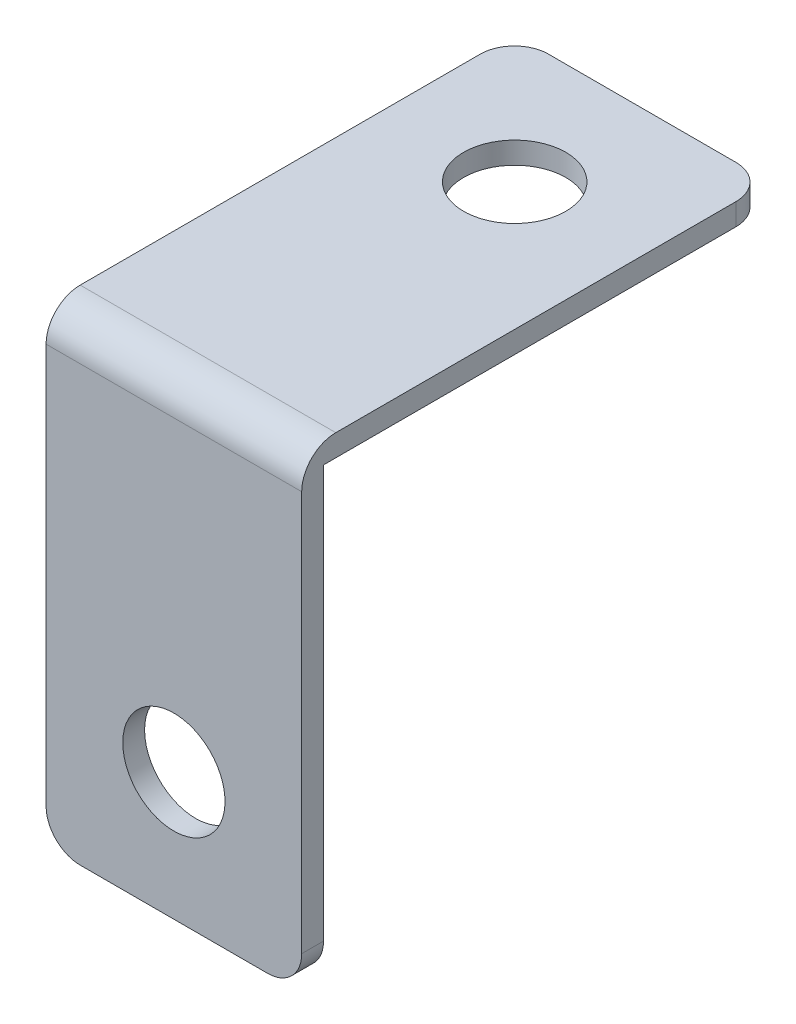
ISO-10303-21;
HEADER;
FILE_DESCRIPTION(('STEP AP214'),'2;1');
FILE_NAME('part.step','',(''),(''),'','','');
FILE_SCHEMA(('AUTOMOTIVE_DESIGN { 1 0 10303 214 1 1 1 1 }'));
ENDSEC;
DATA;
#1=APPLICATION_CONTEXT('core data for automotive mechanical design processes');
#2=APPLICATION_PROTOCOL_DEFINITION('international standard','automotive_design',2000,#1);
#3=PRODUCT_CONTEXT('',#1,'mechanical');
#4=PRODUCT('Part','Part','',(#3));
#5=PRODUCT_RELATED_PRODUCT_CATEGORY('part','',(#4));
#6=PRODUCT_DEFINITION_FORMATION('','',#4);
#7=PRODUCT_DEFINITION_CONTEXT('part definition',#1,'design');
#8=PRODUCT_DEFINITION('design','',#6,#7);
#9=PRODUCT_DEFINITION_SHAPE('','',#8);
#10=(LENGTH_UNIT() NAMED_UNIT(*) SI_UNIT(.MILLI.,.METRE.));
#11=(NAMED_UNIT(*) PLANE_ANGLE_UNIT() SI_UNIT($,.RADIAN.));
#12=(NAMED_UNIT(*) SI_UNIT($,.STERADIAN.) SOLID_ANGLE_UNIT());
#13=UNCERTAINTY_MEASURE_WITH_UNIT(LENGTH_MEASURE(1.E-05),#10,'distance_accuracy_value','');
#14=(GEOMETRIC_REPRESENTATION_CONTEXT(3) GLOBAL_UNCERTAINTY_ASSIGNED_CONTEXT((#13)) GLOBAL_UNIT_ASSIGNED_CONTEXT((#10,
#11,#12)) REPRESENTATION_CONTEXT('',''));
#15=CARTESIAN_POINT('',(0.,0.,0.));
#16=DIRECTION('',(0.,0.,1.));
#17=DIRECTION('',(1.,0.,0.));
#18=AXIS2_PLACEMENT_3D('',#15,#16,#17);
#19=CARTESIAN_POINT('',(0.,0.,17.4498));
#20=DIRECTION('',(1.,0.,0.));
#21=DIRECTION('',(0.,0.,-1.));
#22=AXIS2_PLACEMENT_3D('',#19,#20,#21);
#23=PLANE('',#22);
#24=DIRECTION('',(0.,-1.,0.));
#25=VECTOR('',#24,1.);
#26=CARTESIAN_POINT('',(0.,0.,17.4498));
#27=LINE('',#26,#25);
#28=CARTESIAN_POINT('',(0.,-0.4572,17.4498));
#29=VERTEX_POINT('',#28);
#30=CARTESIAN_POINT('',(0.,-15.367,17.4498));
#31=VERTEX_POINT('',#30);
#32=EDGE_CURVE('E234',#29,#31,#27,.T.);
#33=ORIENTED_EDGE('',*,*,#32,.F.);
#34=CARTESIAN_POINT('',(0.,-0.4572,16.1798));
#35=DIRECTION('',(1.,0.,0.));
#36=DIRECTION('',(0.,0.,-1.));
#37=AXIS2_PLACEMENT_3D('',#34,#35,#36);
#38=CIRCLE('',#37,1.27);
#39=CARTESIAN_POINT('',(0.,0.8128,16.1798));
#40=VERTEX_POINT('',#39);
#41=EDGE_CURVE('E186',#29,#40,#38,.F.);
#42=ORIENTED_EDGE('',*,*,#41,.T.);
#43=DIRECTION('',(0.,0.,-1.));
#44=VECTOR('',#43,1.);
#45=CARTESIAN_POINT('',(0.,0.8128,17.4498));
#46=LINE('',#45,#44);
#47=CARTESIAN_POINT('',(0.,0.8128,1.27));
#48=VERTEX_POINT('',#47);
#49=EDGE_CURVE('E159',#40,#48,#46,.T.);
#50=ORIENTED_EDGE('',*,*,#49,.T.);
#51=DIRECTION('',(0.,-1.,0.));
#52=VECTOR('',#51,1.);
#53=CARTESIAN_POINT('',(0.,0.,1.27));
#54=LINE('',#53,#52);
#55=CARTESIAN_POINT('',(0.,0.,1.27));
#56=VERTEX_POINT('',#55);
#57=EDGE_CURVE('E178',#48,#56,#54,.T.);
#58=ORIENTED_EDGE('',*,*,#57,.T.);
#59=DIRECTION('',(0.,0.,-1.));
#60=VECTOR('',#59,1.);
#61=CARTESIAN_POINT('',(0.,0.,17.4498));
#62=LINE('',#61,#60);
#63=CARTESIAN_POINT('',(0.,0.,16.637));
#64=VERTEX_POINT('',#63);
#65=EDGE_CURVE('E151',#64,#56,#62,.T.);
#66=ORIENTED_EDGE('',*,*,#65,.F.);
#67=DIRECTION('',(0.,1.,0.));
#68=VECTOR('',#67,1.);
#69=CARTESIAN_POINT('',(0.,-16.637,16.637));
#70=LINE('',#69,#68);
#71=CARTESIAN_POINT('',(0.,-15.367,16.637));
#72=VERTEX_POINT('',#71);
#73=EDGE_CURVE('E136',#72,#64,#70,.T.);
#74=ORIENTED_EDGE('',*,*,#73,.F.);
#75=DIRECTION('',(0.,0.,1.));
#76=VECTOR('',#75,1.);
#77=CARTESIAN_POINT('',(0.,-15.367,17.4498));
#78=LINE('',#77,#76);
#79=EDGE_CURVE('E182',#72,#31,#78,.T.);
#80=ORIENTED_EDGE('',*,*,#79,.T.);
#81=EDGE_LOOP('',(#33,#42,#50,#58,#66,#74,#80));
#82=FACE_BOUND('',#81,.T.);
#83=ADVANCED_FACE('F39',(#82),#23,.F.);
#84=CARTESIAN_POINT('',(0.,0.,17.4498));
#85=DIRECTION('',(0.,1.,0.));
#86=DIRECTION('',(0.,0.,1.));
#87=AXIS2_PLACEMENT_3D('',#84,#85,#86);
#88=PLANE('',#87);
#89=CARTESIAN_POINT('',(4.7625,0.,4.7498));
#90=DIRECTION('',(0.,-1.,0.));
#91=DIRECTION('',(0.,0.,-1.));
#92=AXIS2_PLACEMENT_3D('',#89,#90,#91);
#93=CIRCLE('',#92,1.905);
#94=CARTESIAN_POINT('',(4.7625,0.,2.8448));
#95=VERTEX_POINT('',#94);
#96=EDGE_CURVE('E168',#95,#95,#93,.T.);
#97=ORIENTED_EDGE('',*,*,#96,.F.);
#98=EDGE_LOOP('',(#97));
#99=FACE_BOUND('',#98,.T.);
#100=DIRECTION('',(1.,0.,0.));
#101=VECTOR('',#100,1.);
#102=CARTESIAN_POINT('',(0.,0.,0.));
#103=LINE('',#102,#101);
#104=CARTESIAN_POINT('',(1.27,0.,0.));
#105=VERTEX_POINT('',#104);
#106=CARTESIAN_POINT('',(8.255,0.,0.));
#107=VERTEX_POINT('',#106);
#108=EDGE_CURVE('E146',#105,#107,#103,.T.);
#109=ORIENTED_EDGE('',*,*,#108,.T.);
#110=CARTESIAN_POINT('',(8.255,0.,1.27));
#111=DIRECTION('',(0.,1.,0.));
#112=DIRECTION('',(0.,0.,1.));
#113=AXIS2_PLACEMENT_3D('',#110,#111,#112);
#114=CIRCLE('',#113,1.27);
#115=CARTESIAN_POINT('',(9.525,0.,1.27));
#116=VERTEX_POINT('',#115);
#117=EDGE_CURVE('E11',#107,#116,#114,.F.);
#118=ORIENTED_EDGE('',*,*,#117,.T.);
#119=DIRECTION('',(0.,0.,-1.));
#120=VECTOR('',#119,1.);
#121=CARTESIAN_POINT('',(9.525,0.,17.4498));
#122=LINE('',#121,#120);
#123=CARTESIAN_POINT('',(9.525,0.,16.637));
#124=VERTEX_POINT('',#123);
#125=EDGE_CURVE('E129',#124,#116,#122,.T.);
#126=ORIENTED_EDGE('',*,*,#125,.F.);
#127=DIRECTION('',(-1.,0.,0.));
#128=VECTOR('',#127,1.);
#129=CARTESIAN_POINT('',(0.,0.,16.637));
#130=LINE('',#129,#128);
#131=EDGE_CURVE('E140',#124,#64,#130,.T.);
#132=ORIENTED_EDGE('',*,*,#131,.T.);
#133=ORIENTED_EDGE('',*,*,#65,.T.);
#134=CARTESIAN_POINT('',(1.27,0.,1.27));
#135=DIRECTION('',(0.,1.,0.));
#136=DIRECTION('',(0.,0.,1.));
#137=AXIS2_PLACEMENT_3D('',#134,#135,#136);
#138=CIRCLE('',#137,1.27);
#139=EDGE_CURVE('E48',#56,#105,#138,.F.);
#140=ORIENTED_EDGE('',*,*,#139,.T.);
#141=EDGE_LOOP('',(#109,#118,#126,#132,#133,#140));
#142=FACE_BOUND('',#141,.T.);
#143=ADVANCED_FACE('F148',(#99,#142),#88,.F.);
#144=CARTESIAN_POINT('',(9.525,0.,17.4498));
#145=DIRECTION('',(-1.,0.,0.));
#146=DIRECTION('',(0.,0.,1.));
#147=AXIS2_PLACEMENT_3D('',#144,#145,#146);
#148=PLANE('',#147);
#149=DIRECTION('',(0.,0.,-1.));
#150=VECTOR('',#149,1.);
#151=CARTESIAN_POINT('',(9.525,0.8128,17.4498));
#152=LINE('',#151,#150);
#153=CARTESIAN_POINT('',(9.525,0.8128,16.1798));
#154=VERTEX_POINT('',#153);
#155=CARTESIAN_POINT('',(9.525,0.8128,1.27));
#156=VERTEX_POINT('',#155);
#157=EDGE_CURVE('E152',#154,#156,#152,.T.);
#158=ORIENTED_EDGE('',*,*,#157,.F.);
#159=CARTESIAN_POINT('',(9.525,-0.4572,16.1798));
#160=DIRECTION('',(-1.,0.,0.));
#161=DIRECTION('',(0.,0.,1.));
#162=AXIS2_PLACEMENT_3D('',#159,#160,#161);
#163=CIRCLE('',#162,1.27);
#164=CARTESIAN_POINT('',(9.525,-0.4572,17.4498));
#165=VERTEX_POINT('',#164);
#166=EDGE_CURVE('E203',#154,#165,#163,.F.);
#167=ORIENTED_EDGE('',*,*,#166,.T.);
#168=DIRECTION('',(0.,1.,0.));
#169=VECTOR('',#168,1.);
#170=CARTESIAN_POINT('',(9.525,0.,17.4498));
#171=LINE('',#170,#169);
#172=CARTESIAN_POINT('',(9.525,-15.367,17.4498));
#173=VERTEX_POINT('',#172);
#174=EDGE_CURVE('E241',#173,#165,#171,.T.);
#175=ORIENTED_EDGE('',*,*,#174,.F.);
#176=DIRECTION('',(0.,0.,-1.));
#177=VECTOR('',#176,1.);
#178=CARTESIAN_POINT('',(9.525,-15.367,16.637));
#179=LINE('',#178,#177);
#180=CARTESIAN_POINT('',(9.525,-15.367,16.637));
#181=VERTEX_POINT('',#180);
#182=EDGE_CURVE('E133',#173,#181,#179,.T.);
#183=ORIENTED_EDGE('',*,*,#182,.T.);
#184=DIRECTION('',(0.,1.,0.));
#185=VECTOR('',#184,1.);
#186=CARTESIAN_POINT('',(9.525,-16.637,16.637));
#187=LINE('',#186,#185);
#188=EDGE_CURVE('E123',#181,#124,#187,.T.);
#189=ORIENTED_EDGE('',*,*,#188,.T.);
#190=ORIENTED_EDGE('',*,*,#125,.T.);
#191=DIRECTION('',(0.,1.,0.));
#192=VECTOR('',#191,1.);
#193=CARTESIAN_POINT('',(9.525,0.8128,1.27));
#194=LINE('',#193,#192);
#195=EDGE_CURVE('E198',#116,#156,#194,.T.);
#196=ORIENTED_EDGE('',*,*,#195,.T.);
#197=EDGE_LOOP('',(#158,#167,#175,#183,#189,#190,#196));
#198=FACE_BOUND('',#197,.T.);
#199=ADVANCED_FACE('F126',(#198),#148,.F.);
#200=CARTESIAN_POINT('',(0.,0.8128,17.4498));
#201=DIRECTION('',(0.,-1.,0.));
#202=DIRECTION('',(0.,0.,-1.));
#203=AXIS2_PLACEMENT_3D('',#200,#201,#202);
#204=PLANE('',#203);
#205=CARTESIAN_POINT('',(4.7625,0.812799999999999,4.7498));
#206=DIRECTION('',(0.,-1.,0.));
#207=DIRECTION('',(0.,0.,-1.));
#208=AXIS2_PLACEMENT_3D('',#205,#206,#207);
#209=CIRCLE('',#208,1.905);
#210=CARTESIAN_POINT('',(4.7625,0.812799999999999,2.8448));
#211=VERTEX_POINT('',#210);
#212=EDGE_CURVE('E163',#211,#211,#209,.T.);
#213=ORIENTED_EDGE('',*,*,#212,.T.);
#214=EDGE_LOOP('',(#213));
#215=FACE_BOUND('',#214,.T.);
#216=ORIENTED_EDGE('',*,*,#49,.F.);
#217=DIRECTION('',(-1.,0.,0.));
#218=VECTOR('',#217,1.);
#219=CARTESIAN_POINT('',(0.,0.8128,16.1798));
#220=LINE('',#219,#218);
#221=EDGE_CURVE('E195',#40,#154,#220,.F.);
#222=ORIENTED_EDGE('',*,*,#221,.T.);
#223=ORIENTED_EDGE('',*,*,#157,.T.);
#224=CARTESIAN_POINT('',(8.255,0.8128,1.27));
#225=DIRECTION('',(0.,-1.,0.));
#226=DIRECTION('',(0.,0.,-1.));
#227=AXIS2_PLACEMENT_3D('',#224,#225,#226);
#228=CIRCLE('',#227,1.27);
#229=CARTESIAN_POINT('',(8.255,0.8128,0.));
#230=VERTEX_POINT('',#229);
#231=EDGE_CURVE('E192',#156,#230,#228,.F.);
#232=ORIENTED_EDGE('',*,*,#231,.T.);
#233=DIRECTION('',(-1.,0.,0.));
#234=VECTOR('',#233,1.);
#235=CARTESIAN_POINT('',(0.,0.8128,0.));
#236=LINE('',#235,#234);
#237=CARTESIAN_POINT('',(1.27,0.8128,0.));
#238=VERTEX_POINT('',#237);
#239=EDGE_CURVE('E226',#230,#238,#236,.T.);
#240=ORIENTED_EDGE('',*,*,#239,.T.);
#241=CARTESIAN_POINT('',(1.27,0.8128,1.27));
#242=DIRECTION('',(0.,-1.,0.));
#243=DIRECTION('',(0.,0.,-1.));
#244=AXIS2_PLACEMENT_3D('',#241,#242,#243);
#245=CIRCLE('',#244,1.27);
#246=EDGE_CURVE('E189',#238,#48,#245,.F.);
#247=ORIENTED_EDGE('',*,*,#246,.T.);
#248=EDGE_LOOP('',(#216,#222,#223,#232,#240,#247));
#249=FACE_BOUND('',#248,.T.);
#250=ADVANCED_FACE('F231',(#215,#249),#204,.F.);
#251=CARTESIAN_POINT('',(0.,0.,17.4498));
#252=DIRECTION('',(0.,0.,-1.));
#253=DIRECTION('',(-1.,0.,0.));
#254=AXIS2_PLACEMENT_3D('',#251,#252,#253);
#255=PLANE('',#254);
#256=CARTESIAN_POINT('',(4.7625,-11.8872,17.4498));
#257=DIRECTION('',(0.,0.,-1.));
#258=DIRECTION('',(-1.,0.,0.));
#259=AXIS2_PLACEMENT_3D('',#256,#257,#258);
#260=CIRCLE('',#259,1.905);
#261=CARTESIAN_POINT('',(2.8575,-11.8872,17.4498));
#262=VERTEX_POINT('',#261);
#263=EDGE_CURVE('E261',#262,#262,#260,.T.);
#264=ORIENTED_EDGE('',*,*,#263,.T.);
#265=EDGE_LOOP('',(#264));
#266=FACE_BOUND('',#265,.T.);
#267=ORIENTED_EDGE('',*,*,#174,.T.);
#268=DIRECTION('',(-1.,0.,0.));
#269=VECTOR('',#268,1.);
#270=CARTESIAN_POINT('',(0.,-0.4572,17.4498));
#271=LINE('',#270,#269);
#272=EDGE_CURVE('E174',#165,#29,#271,.T.);
#273=ORIENTED_EDGE('',*,*,#272,.T.);
#274=ORIENTED_EDGE('',*,*,#32,.T.);
#275=CARTESIAN_POINT('',(1.27,-15.367,17.4498));
#276=DIRECTION('',(0.,0.,-1.));
#277=DIRECTION('',(-1.,0.,0.));
#278=AXIS2_PLACEMENT_3D('',#275,#276,#277);
#279=CIRCLE('',#278,1.27);
#280=CARTESIAN_POINT('',(1.27,-16.637,17.4498));
#281=VERTEX_POINT('',#280);
#282=EDGE_CURVE('E171',#31,#281,#279,.F.);
#283=ORIENTED_EDGE('',*,*,#282,.T.);
#284=DIRECTION('',(1.,0.,0.));
#285=VECTOR('',#284,1.);
#286=CARTESIAN_POINT('',(0.,-16.637,17.4498));
#287=LINE('',#286,#285);
#288=CARTESIAN_POINT('',(8.255,-16.637,17.4498));
#289=VERTEX_POINT('',#288);
#290=EDGE_CURVE('E167',#281,#289,#287,.T.);
#291=ORIENTED_EDGE('',*,*,#290,.T.);
#292=CARTESIAN_POINT('',(8.255,-15.367,17.4498));
#293=DIRECTION('',(0.,0.,-1.));
#294=DIRECTION('',(-1.,0.,0.));
#295=AXIS2_PLACEMENT_3D('',#292,#293,#294);
#296=CIRCLE('',#295,1.27);
#297=EDGE_CURVE('E156',#289,#173,#296,.F.);
#298=ORIENTED_EDGE('',*,*,#297,.T.);
#299=EDGE_LOOP('',(#267,#273,#274,#283,#291,#298));
#300=FACE_BOUND('',#299,.T.);
#301=ADVANCED_FACE('F283',(#266,#300),#255,.F.);
#302=CARTESIAN_POINT('',(0.,0.,0.));
#303=DIRECTION('',(0.,0.,-1.));
#304=DIRECTION('',(-1.,0.,0.));
#305=AXIS2_PLACEMENT_3D('',#302,#303,#304);
#306=PLANE('',#305);
#307=ORIENTED_EDGE('',*,*,#239,.F.);
#308=DIRECTION('',(0.,1.,0.));
#309=VECTOR('',#308,1.);
#310=CARTESIAN_POINT('',(8.255,0.,0.));
#311=LINE('',#310,#309);
#312=EDGE_CURVE('E55',#230,#107,#311,.F.);
#313=ORIENTED_EDGE('',*,*,#312,.T.);
#314=ORIENTED_EDGE('',*,*,#108,.F.);
#315=DIRECTION('',(0.,-1.,0.));
#316=VECTOR('',#315,1.);
#317=CARTESIAN_POINT('',(1.27,0.8128,0.));
#318=LINE('',#317,#316);
#319=EDGE_CURVE('E218',#105,#238,#318,.F.);
#320=ORIENTED_EDGE('',*,*,#319,.T.);
#321=EDGE_LOOP('',(#307,#313,#314,#320));
#322=FACE_BOUND('',#321,.T.);
#323=ADVANCED_FACE('F225',(#322),#306,.T.);
#324=CARTESIAN_POINT('',(0.,-16.637,16.637));
#325=DIRECTION('',(0.,0.,-1.));
#326=DIRECTION('',(-1.,0.,0.));
#327=AXIS2_PLACEMENT_3D('',#324,#325,#326);
#328=PLANE('',#327);
#329=CARTESIAN_POINT('',(4.7625,-11.8872,16.637));
#330=DIRECTION('',(0.,0.,-1.));
#331=DIRECTION('',(-1.,0.,0.));
#332=AXIS2_PLACEMENT_3D('',#329,#330,#331);
#333=CIRCLE('',#332,1.905);
#334=CARTESIAN_POINT('',(2.8575,-11.8872,16.637));
#335=VERTEX_POINT('',#334);
#336=EDGE_CURVE('E265',#335,#335,#333,.T.);
#337=ORIENTED_EDGE('',*,*,#336,.F.);
#338=EDGE_LOOP('',(#337));
#339=FACE_BOUND('',#338,.T.);
#340=DIRECTION('',(-1.,0.,0.));
#341=VECTOR('',#340,1.);
#342=CARTESIAN_POINT('',(0.,-16.637,16.637));
#343=LINE('',#342,#341);
#344=CARTESIAN_POINT('',(8.255,-16.637,16.637));
#345=VERTEX_POINT('',#344);
#346=CARTESIAN_POINT('',(1.27,-16.637,16.637));
#347=VERTEX_POINT('',#346);
#348=EDGE_CURVE('E137',#345,#347,#343,.T.);
#349=ORIENTED_EDGE('',*,*,#348,.T.);
#350=CARTESIAN_POINT('',(1.27,-15.367,16.637));
#351=DIRECTION('',(0.,0.,-1.));
#352=DIRECTION('',(-1.,0.,0.));
#353=AXIS2_PLACEMENT_3D('',#350,#351,#352);
#354=CIRCLE('',#353,1.27);
#355=EDGE_CURVE('E215',#347,#72,#354,.T.);
#356=ORIENTED_EDGE('',*,*,#355,.T.);
#357=ORIENTED_EDGE('',*,*,#73,.T.);
#358=ORIENTED_EDGE('',*,*,#131,.F.);
#359=ORIENTED_EDGE('',*,*,#188,.F.);
#360=CARTESIAN_POINT('',(8.255,-15.367,16.637));
#361=DIRECTION('',(0.,0.,-1.));
#362=DIRECTION('',(-1.,0.,0.));
#363=AXIS2_PLACEMENT_3D('',#360,#361,#362);
#364=CIRCLE('',#363,1.27);
#365=EDGE_CURVE('E212',#181,#345,#364,.T.);
#366=ORIENTED_EDGE('',*,*,#365,.T.);
#367=EDGE_LOOP('',(#349,#356,#357,#358,#359,#366));
#368=FACE_BOUND('',#367,.T.);
#369=ADVANCED_FACE('F142',(#339,#368),#328,.T.);
#370=CARTESIAN_POINT('',(0.,-16.637,0.));
#371=DIRECTION('',(0.,-1.,0.));
#372=DIRECTION('',(0.,0.,-1.));
#373=AXIS2_PLACEMENT_3D('',#370,#371,#372);
#374=PLANE('',#373);
#375=ORIENTED_EDGE('',*,*,#290,.F.);
#376=DIRECTION('',(0.,0.,1.));
#377=VECTOR('',#376,1.);
#378=CARTESIAN_POINT('',(1.27,-16.637,16.637));
#379=LINE('',#378,#377);
#380=EDGE_CURVE('E209',#281,#347,#379,.F.);
#381=ORIENTED_EDGE('',*,*,#380,.T.);
#382=ORIENTED_EDGE('',*,*,#348,.F.);
#383=DIRECTION('',(0.,0.,-1.));
#384=VECTOR('',#383,1.);
#385=CARTESIAN_POINT('',(8.255,-16.637,17.4498));
#386=LINE('',#385,#384);
#387=EDGE_CURVE('E206',#345,#289,#386,.F.);
#388=ORIENTED_EDGE('',*,*,#387,.T.);
#389=EDGE_LOOP('',(#375,#381,#382,#388));
#390=FACE_BOUND('',#389,.T.);
#391=ADVANCED_FACE('F274',(#390),#374,.T.);
#392=CARTESIAN_POINT('',(4.7625,17.4498,4.7498));
#393=DIRECTION('',(0.,-1.,0.));
#394=DIRECTION('',(0.,0.,-1.));
#395=AXIS2_PLACEMENT_3D('',#392,#393,#394);
#396=CYLINDRICAL_SURFACE('',#395,1.905);
#397=ORIENTED_EDGE('',*,*,#96,.T.);
#398=EDGE_LOOP('',(#397));
#399=FACE_BOUND('',#398,.T.);
#400=ORIENTED_EDGE('',*,*,#212,.F.);
#401=EDGE_LOOP('',(#400));
#402=FACE_BOUND('',#401,.T.);
#403=ADVANCED_FACE('F280',(#399,#402),#396,.F.);
#404=CARTESIAN_POINT('',(4.7625,-11.8872,34.0868));
#405=DIRECTION('',(0.,0.,-1.));
#406=DIRECTION('',(-1.,0.,0.));
#407=AXIS2_PLACEMENT_3D('',#404,#405,#406);
#408=CYLINDRICAL_SURFACE('',#407,1.905);
#409=ORIENTED_EDGE('',*,*,#336,.T.);
#410=EDGE_LOOP('',(#409));
#411=FACE_BOUND('',#410,.T.);
#412=ORIENTED_EDGE('',*,*,#263,.F.);
#413=EDGE_LOOP('',(#412));
#414=FACE_BOUND('',#413,.T.);
#415=ADVANCED_FACE('F270',(#411,#414),#408,.F.);
#416=CARTESIAN_POINT('',(0.,-0.4572,16.1798));
#417=DIRECTION('',(-1.,0.,0.));
#418=DIRECTION('',(0.,0.,1.));
#419=AXIS2_PLACEMENT_3D('',#416,#417,#418);
#420=CYLINDRICAL_SURFACE('',#419,1.27);
#421=ORIENTED_EDGE('',*,*,#166,.F.);
#422=ORIENTED_EDGE('',*,*,#221,.F.);
#423=ORIENTED_EDGE('',*,*,#41,.F.);
#424=ORIENTED_EDGE('',*,*,#272,.F.);
#425=EDGE_LOOP('',(#421,#422,#423,#424));
#426=FACE_BOUND('',#425,.T.);
#427=ADVANCED_FACE('F295',(#426),#420,.T.);
#428=CARTESIAN_POINT('',(1.27,-15.367,17.4498));
#429=DIRECTION('',(0.,0.,-1.));
#430=DIRECTION('',(-1.,0.,0.));
#431=AXIS2_PLACEMENT_3D('',#428,#429,#430);
#432=CYLINDRICAL_SURFACE('',#431,1.27);
#433=ORIENTED_EDGE('',*,*,#355,.F.);
#434=ORIENTED_EDGE('',*,*,#380,.F.);
#435=ORIENTED_EDGE('',*,*,#282,.F.);
#436=ORIENTED_EDGE('',*,*,#79,.F.);
#437=EDGE_LOOP('',(#433,#434,#435,#436));
#438=FACE_BOUND('',#437,.T.);
#439=ADVANCED_FACE('F298',(#438),#432,.T.);
#440=CARTESIAN_POINT('',(8.255,-15.367,17.4498));
#441=DIRECTION('',(0.,0.,1.));
#442=DIRECTION('',(1.,0.,0.));
#443=AXIS2_PLACEMENT_3D('',#440,#441,#442);
#444=CYLINDRICAL_SURFACE('',#443,1.27);
#445=ORIENTED_EDGE('',*,*,#297,.F.);
#446=ORIENTED_EDGE('',*,*,#387,.F.);
#447=ORIENTED_EDGE('',*,*,#365,.F.);
#448=ORIENTED_EDGE('',*,*,#182,.F.);
#449=EDGE_LOOP('',(#445,#446,#447,#448));
#450=FACE_BOUND('',#449,.T.);
#451=ADVANCED_FACE('F302',(#450),#444,.T.);
#452=CARTESIAN_POINT('',(8.255,0.,1.27));
#453=DIRECTION('',(0.,-1.,0.));
#454=DIRECTION('',(0.,0.,-1.));
#455=AXIS2_PLACEMENT_3D('',#452,#453,#454);
#456=CYLINDRICAL_SURFACE('',#455,1.27);
#457=ORIENTED_EDGE('',*,*,#117,.F.);
#458=ORIENTED_EDGE('',*,*,#312,.F.);
#459=ORIENTED_EDGE('',*,*,#231,.F.);
#460=ORIENTED_EDGE('',*,*,#195,.F.);
#461=EDGE_LOOP('',(#457,#458,#459,#460));
#462=FACE_BOUND('',#461,.T.);
#463=ADVANCED_FACE('F305',(#462),#456,.T.);
#464=CARTESIAN_POINT('',(1.27,0.,1.27));
#465=DIRECTION('',(0.,1.,0.));
#466=DIRECTION('',(0.,0.,1.));
#467=AXIS2_PLACEMENT_3D('',#464,#465,#466);
#468=CYLINDRICAL_SURFACE('',#467,1.27);
#469=ORIENTED_EDGE('',*,*,#246,.F.);
#470=ORIENTED_EDGE('',*,*,#319,.F.);
#471=ORIENTED_EDGE('',*,*,#139,.F.);
#472=ORIENTED_EDGE('',*,*,#57,.F.);
#473=EDGE_LOOP('',(#469,#470,#471,#472));
#474=FACE_BOUND('',#473,.T.);
#475=ADVANCED_FACE('F41',(#474),#468,.T.);
#476=CLOSED_SHELL('',(#83,#143,#199,#250,#301,#323,#369,#391,#403,#415,#427,#439,#451,#463,#475));
#477=MANIFOLD_SOLID_BREP('B2',#476);
#478=ADVANCED_BREP_SHAPE_REPRESENTATION('',(#18,#477),#14);
#479=SHAPE_DEFINITION_REPRESENTATION(#9,#478);
ENDSEC;
END-ISO-10303-21;
